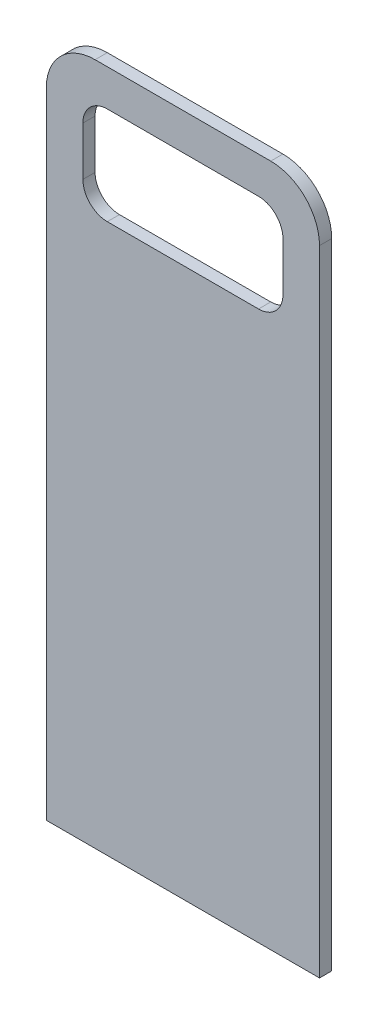
ISO-10303-21;
HEADER;
FILE_DESCRIPTION(('STEP AP214'),'2;1');
FILE_NAME('part.step','',(''),(''),'','','');
FILE_SCHEMA(('AUTOMOTIVE_DESIGN { 1 0 10303 214 1 1 1 1 }'));
ENDSEC;
DATA;
#1=APPLICATION_CONTEXT('core data for automotive mechanical design processes');
#2=APPLICATION_PROTOCOL_DEFINITION('international standard','automotive_design',2000,#1);
#3=PRODUCT_CONTEXT('',#1,'mechanical');
#4=PRODUCT('Part','Part','',(#3));
#5=PRODUCT_RELATED_PRODUCT_CATEGORY('part','',(#4));
#6=PRODUCT_DEFINITION_FORMATION('','',#4);
#7=PRODUCT_DEFINITION_CONTEXT('part definition',#1,'design');
#8=PRODUCT_DEFINITION('design','',#6,#7);
#9=PRODUCT_DEFINITION_SHAPE('','',#8);
#10=(LENGTH_UNIT() NAMED_UNIT(*) SI_UNIT(.MILLI.,.METRE.));
#11=(NAMED_UNIT(*) PLANE_ANGLE_UNIT() SI_UNIT($,.RADIAN.));
#12=(NAMED_UNIT(*) SI_UNIT($,.STERADIAN.) SOLID_ANGLE_UNIT());
#13=UNCERTAINTY_MEASURE_WITH_UNIT(LENGTH_MEASURE(1.E-05),#10,'distance_accuracy_value','');
#14=(GEOMETRIC_REPRESENTATION_CONTEXT(3) GLOBAL_UNCERTAINTY_ASSIGNED_CONTEXT((#13)) GLOBAL_UNIT_ASSIGNED_CONTEXT((#10,
#11,#12)) REPRESENTATION_CONTEXT('',''));
#15=CARTESIAN_POINT('',(0.,0.,0.));
#16=DIRECTION('',(0.,0.,1.));
#17=DIRECTION('',(1.,0.,0.));
#18=AXIS2_PLACEMENT_3D('',#15,#16,#17);
#19=CARTESIAN_POINT('',(0.,0.,5.));
#20=DIRECTION('',(0.,0.,1.));
#21=DIRECTION('',(1.,0.,0.));
#22=AXIS2_PLACEMENT_3D('',#19,#20,#21);
#23=PLANE('',#22);
#24=DIRECTION('',(-1.,0.,0.));
#25=VECTOR('',#24,1.);
#26=CARTESIAN_POINT('',(0.,280.,5.));
#27=LINE('',#26,#25);
#28=CARTESIAN_POINT('',(-20.,280.,5.));
#29=VERTEX_POINT('',#28);
#30=CARTESIAN_POINT('',(-92.,280.,5.));
#31=VERTEX_POINT('',#30);
#32=EDGE_CURVE('E147',#29,#31,#27,.T.);
#33=ORIENTED_EDGE('',*,*,#32,.T.);
#34=CARTESIAN_POINT('',(-92.,260.,5.));
#35=DIRECTION('',(0.,0.,1.));
#36=DIRECTION('',(1.,0.,0.));
#37=AXIS2_PLACEMENT_3D('',#34,#35,#36);
#38=CIRCLE('',#37,20.);
#39=CARTESIAN_POINT('',(-112.,260.,5.));
#40=VERTEX_POINT('',#39);
#41=EDGE_CURVE('E143',#31,#40,#38,.T.);
#42=ORIENTED_EDGE('',*,*,#41,.T.);
#43=DIRECTION('',(0.,-1.,0.));
#44=VECTOR('',#43,1.);
#45=CARTESIAN_POINT('',(-112.,0.,5.));
#46=LINE('',#45,#44);
#47=CARTESIAN_POINT('',(-112.,0.,5.));
#48=VERTEX_POINT('',#47);
#49=EDGE_CURVE('E135',#40,#48,#46,.T.);
#50=ORIENTED_EDGE('',*,*,#49,.T.);
#51=DIRECTION('',(1.,0.,0.));
#52=VECTOR('',#51,1.);
#53=CARTESIAN_POINT('',(0.,0.,5.));
#54=LINE('',#53,#52);
#55=CARTESIAN_POINT('',(0.,0.,5.));
#56=VERTEX_POINT('',#55);
#57=EDGE_CURVE('E140',#48,#56,#54,.T.);
#58=ORIENTED_EDGE('',*,*,#57,.T.);
#59=DIRECTION('',(0.,1.,0.));
#60=VECTOR('',#59,1.);
#61=CARTESIAN_POINT('',(0.,0.,5.));
#62=LINE('',#61,#60);
#63=CARTESIAN_POINT('',(0.,260.,5.));
#64=VERTEX_POINT('',#63);
#65=EDGE_CURVE('E175',#56,#64,#62,.T.);
#66=ORIENTED_EDGE('',*,*,#65,.T.);
#67=CARTESIAN_POINT('',(-20.,260.,5.));
#68=DIRECTION('',(0.,0.,1.));
#69=DIRECTION('',(1.,0.,0.));
#70=AXIS2_PLACEMENT_3D('',#67,#68,#69);
#71=CIRCLE('',#70,20.);
#72=EDGE_CURVE('E187',#64,#29,#71,.T.);
#73=ORIENTED_EDGE('',*,*,#72,.T.);
#74=EDGE_LOOP('',(#33,#42,#50,#58,#66,#73));
#75=FACE_BOUND('',#74,.T.);
#76=DIRECTION('',(-1.,0.,0.));
#77=VECTOR('',#76,1.);
#78=CARTESIAN_POINT('',(-15.,265.,5.));
#79=LINE('',#78,#77);
#80=CARTESIAN_POINT('',(-25.,265.,5.));
#81=VERTEX_POINT('',#80);
#82=CARTESIAN_POINT('',(-87.,265.,5.));
#83=VERTEX_POINT('',#82);
#84=EDGE_CURVE('E242',#81,#83,#79,.T.);
#85=ORIENTED_EDGE('',*,*,#84,.F.);
#86=CARTESIAN_POINT('',(-25.,255.,5.));
#87=DIRECTION('',(0.,0.,1.));
#88=DIRECTION('',(1.,0.,0.));
#89=AXIS2_PLACEMENT_3D('',#86,#87,#88);
#90=CIRCLE('',#89,10.);
#91=CARTESIAN_POINT('',(-15.,255.,5.));
#92=VERTEX_POINT('',#91);
#93=EDGE_CURVE('E11',#81,#92,#90,.F.);
#94=ORIENTED_EDGE('',*,*,#93,.T.);
#95=DIRECTION('',(0.,1.,0.));
#96=VECTOR('',#95,1.);
#97=CARTESIAN_POINT('',(-15.,265.,5.));
#98=LINE('',#97,#96);
#99=CARTESIAN_POINT('',(-15.,235.,5.));
#100=VERTEX_POINT('',#99);
#101=EDGE_CURVE('E240',#100,#92,#98,.T.);
#102=ORIENTED_EDGE('',*,*,#101,.F.);
#103=CARTESIAN_POINT('',(-25.,235.,5.));
#104=DIRECTION('',(0.,0.,1.));
#105=DIRECTION('',(1.,0.,0.));
#106=AXIS2_PLACEMENT_3D('',#103,#104,#105);
#107=CIRCLE('',#106,10.);
#108=CARTESIAN_POINT('',(-25.,225.,5.));
#109=VERTEX_POINT('',#108);
#110=EDGE_CURVE('E221',#100,#109,#107,.F.);
#111=ORIENTED_EDGE('',*,*,#110,.T.);
#112=DIRECTION('',(1.,0.,0.));
#113=VECTOR('',#112,1.);
#114=CARTESIAN_POINT('',(-15.,225.,5.));
#115=LINE('',#114,#113);
#116=CARTESIAN_POINT('',(-87.,225.,5.));
#117=VERTEX_POINT('',#116);
#118=EDGE_CURVE('E170',#117,#109,#115,.T.);
#119=ORIENTED_EDGE('',*,*,#118,.F.);
#120=CARTESIAN_POINT('',(-87.,235.,5.));
#121=DIRECTION('',(0.,0.,1.));
#122=DIRECTION('',(1.,0.,0.));
#123=AXIS2_PLACEMENT_3D('',#120,#121,#122);
#124=CIRCLE('',#123,10.);
#125=CARTESIAN_POINT('',(-97.,235.,5.));
#126=VERTEX_POINT('',#125);
#127=EDGE_CURVE('E213',#117,#126,#124,.F.);
#128=ORIENTED_EDGE('',*,*,#127,.T.);
#129=DIRECTION('',(0.,-1.,0.));
#130=VECTOR('',#129,1.);
#131=CARTESIAN_POINT('',(-97.,265.,5.));
#132=LINE('',#131,#130);
#133=CARTESIAN_POINT('',(-97.,255.,5.));
#134=VERTEX_POINT('',#133);
#135=EDGE_CURVE('E245',#134,#126,#132,.T.);
#136=ORIENTED_EDGE('',*,*,#135,.F.);
#137=CARTESIAN_POINT('',(-87.,255.,5.));
#138=DIRECTION('',(0.,0.,1.));
#139=DIRECTION('',(1.,0.,0.));
#140=AXIS2_PLACEMENT_3D('',#137,#138,#139);
#141=CIRCLE('',#140,10.);
#142=EDGE_CURVE('E217',#134,#83,#141,.F.);
#143=ORIENTED_EDGE('',*,*,#142,.T.);
#144=EDGE_LOOP('',(#85,#94,#102,#111,#119,#128,#136,#143));
#145=FACE_BOUND('',#144,.T.);
#146=ADVANCED_FACE('F35',(#75,#145),#23,.T.);
#147=CARTESIAN_POINT('',(0.,0.,0.));
#148=DIRECTION('',(0.,0.,1.));
#149=DIRECTION('',(1.,0.,0.));
#150=AXIS2_PLACEMENT_3D('',#147,#148,#149);
#151=PLANE('',#150);
#152=DIRECTION('',(0.,-1.,0.));
#153=VECTOR('',#152,1.);
#154=CARTESIAN_POINT('',(-112.,0.,0.));
#155=LINE('',#154,#153);
#156=CARTESIAN_POINT('',(-112.,260.,0.));
#157=VERTEX_POINT('',#156);
#158=CARTESIAN_POINT('',(-112.,0.,0.));
#159=VERTEX_POINT('',#158);
#160=EDGE_CURVE('E153',#157,#159,#155,.T.);
#161=ORIENTED_EDGE('',*,*,#160,.F.);
#162=CARTESIAN_POINT('',(-92.,260.,0.));
#163=DIRECTION('',(0.,0.,1.));
#164=DIRECTION('',(1.,0.,0.));
#165=AXIS2_PLACEMENT_3D('',#162,#163,#164);
#166=CIRCLE('',#165,20.);
#167=CARTESIAN_POINT('',(-92.,280.,0.));
#168=VERTEX_POINT('',#167);
#169=EDGE_CURVE('E180',#157,#168,#166,.F.);
#170=ORIENTED_EDGE('',*,*,#169,.T.);
#171=DIRECTION('',(-1.,0.,0.));
#172=VECTOR('',#171,1.);
#173=CARTESIAN_POINT('',(0.,280.,0.));
#174=LINE('',#173,#172);
#175=CARTESIAN_POINT('',(-20.,280.,0.));
#176=VERTEX_POINT('',#175);
#177=EDGE_CURVE('E169',#176,#168,#174,.T.);
#178=ORIENTED_EDGE('',*,*,#177,.F.);
#179=CARTESIAN_POINT('',(-20.,260.,0.));
#180=DIRECTION('',(0.,0.,1.));
#181=DIRECTION('',(1.,0.,0.));
#182=AXIS2_PLACEMENT_3D('',#179,#180,#181);
#183=CIRCLE('',#182,20.);
#184=CARTESIAN_POINT('',(0.,260.,0.));
#185=VERTEX_POINT('',#184);
#186=EDGE_CURVE('E178',#176,#185,#183,.F.);
#187=ORIENTED_EDGE('',*,*,#186,.T.);
#188=DIRECTION('',(0.,1.,0.));
#189=VECTOR('',#188,1.);
#190=CARTESIAN_POINT('',(0.,0.,0.));
#191=LINE('',#190,#189);
#192=CARTESIAN_POINT('',(0.,0.,0.));
#193=VERTEX_POINT('',#192);
#194=EDGE_CURVE('E166',#193,#185,#191,.T.);
#195=ORIENTED_EDGE('',*,*,#194,.F.);
#196=DIRECTION('',(1.,0.,0.));
#197=VECTOR('',#196,1.);
#198=CARTESIAN_POINT('',(0.,0.,0.));
#199=LINE('',#198,#197);
#200=EDGE_CURVE('E174',#159,#193,#199,.T.);
#201=ORIENTED_EDGE('',*,*,#200,.F.);
#202=EDGE_LOOP('',(#161,#170,#178,#187,#195,#201));
#203=FACE_BOUND('',#202,.T.);
#204=DIRECTION('',(1.,0.,0.));
#205=VECTOR('',#204,1.);
#206=CARTESIAN_POINT('',(-15.,225.,0.));
#207=LINE('',#206,#205);
#208=CARTESIAN_POINT('',(-87.,225.,0.));
#209=VERTEX_POINT('',#208);
#210=CARTESIAN_POINT('',(-25.,225.,0.));
#211=VERTEX_POINT('',#210);
#212=EDGE_CURVE('E243',#209,#211,#207,.T.);
#213=ORIENTED_EDGE('',*,*,#212,.T.);
#214=CARTESIAN_POINT('',(-25.,235.,0.));
#215=DIRECTION('',(0.,0.,1.));
#216=DIRECTION('',(1.,0.,0.));
#217=AXIS2_PLACEMENT_3D('',#214,#215,#216);
#218=CIRCLE('',#217,10.);
#219=CARTESIAN_POINT('',(-15.,235.,0.));
#220=VERTEX_POINT('',#219);
#221=EDGE_CURVE('E219',#211,#220,#218,.T.);
#222=ORIENTED_EDGE('',*,*,#221,.T.);
#223=DIRECTION('',(0.,1.,0.));
#224=VECTOR('',#223,1.);
#225=CARTESIAN_POINT('',(-15.,265.,0.));
#226=LINE('',#225,#224);
#227=CARTESIAN_POINT('',(-15.,255.,0.));
#228=VERTEX_POINT('',#227);
#229=EDGE_CURVE('E229',#220,#228,#226,.T.);
#230=ORIENTED_EDGE('',*,*,#229,.T.);
#231=CARTESIAN_POINT('',(-25.,255.,0.));
#232=DIRECTION('',(0.,0.,1.));
#233=DIRECTION('',(1.,0.,0.));
#234=AXIS2_PLACEMENT_3D('',#231,#232,#233);
#235=CIRCLE('',#234,10.);
#236=CARTESIAN_POINT('',(-25.,265.,0.));
#237=VERTEX_POINT('',#236);
#238=EDGE_CURVE('E43',#228,#237,#235,.T.);
#239=ORIENTED_EDGE('',*,*,#238,.T.);
#240=DIRECTION('',(-1.,0.,0.));
#241=VECTOR('',#240,1.);
#242=CARTESIAN_POINT('',(-15.,265.,0.));
#243=LINE('',#242,#241);
#244=CARTESIAN_POINT('',(-87.,265.,0.));
#245=VERTEX_POINT('',#244);
#246=EDGE_CURVE('E228',#237,#245,#243,.T.);
#247=ORIENTED_EDGE('',*,*,#246,.T.);
#248=CARTESIAN_POINT('',(-87.,255.,0.));
#249=DIRECTION('',(0.,0.,1.));
#250=DIRECTION('',(1.,0.,0.));
#251=AXIS2_PLACEMENT_3D('',#248,#249,#250);
#252=CIRCLE('',#251,10.);
#253=CARTESIAN_POINT('',(-97.,255.,0.));
#254=VERTEX_POINT('',#253);
#255=EDGE_CURVE('E215',#245,#254,#252,.T.);
#256=ORIENTED_EDGE('',*,*,#255,.T.);
#257=DIRECTION('',(0.,-1.,0.));
#258=VECTOR('',#257,1.);
#259=CARTESIAN_POINT('',(-97.,265.,0.));
#260=LINE('',#259,#258);
#261=CARTESIAN_POINT('',(-97.,235.,0.));
#262=VERTEX_POINT('',#261);
#263=EDGE_CURVE('E237',#254,#262,#260,.T.);
#264=ORIENTED_EDGE('',*,*,#263,.T.);
#265=CARTESIAN_POINT('',(-87.,235.,0.));
#266=DIRECTION('',(0.,0.,1.));
#267=DIRECTION('',(1.,0.,0.));
#268=AXIS2_PLACEMENT_3D('',#265,#266,#267);
#269=CIRCLE('',#268,10.);
#270=EDGE_CURVE('E211',#262,#209,#269,.T.);
#271=ORIENTED_EDGE('',*,*,#270,.T.);
#272=EDGE_LOOP('',(#213,#222,#230,#239,#247,#256,#264,#271));
#273=FACE_BOUND('',#272,.T.);
#274=ADVANCED_FACE('F227',(#203,#273),#151,.F.);
#275=CARTESIAN_POINT('',(0.,0.,5.));
#276=DIRECTION('',(-1.,0.,0.));
#277=DIRECTION('',(0.,0.,1.));
#278=AXIS2_PLACEMENT_3D('',#275,#276,#277);
#279=PLANE('',#278);
#280=ORIENTED_EDGE('',*,*,#194,.T.);
#281=DIRECTION('',(0.,0.,-1.));
#282=VECTOR('',#281,1.);
#283=CARTESIAN_POINT('',(0.,260.,5.));
#284=LINE('',#283,#282);
#285=EDGE_CURVE('E190',#185,#64,#284,.F.);
#286=ORIENTED_EDGE('',*,*,#285,.T.);
#287=ORIENTED_EDGE('',*,*,#65,.F.);
#288=DIRECTION('',(0.,0.,-1.));
#289=VECTOR('',#288,1.);
#290=CARTESIAN_POINT('',(0.,0.,5.));
#291=LINE('',#290,#289);
#292=EDGE_CURVE('E157',#56,#193,#291,.T.);
#293=ORIENTED_EDGE('',*,*,#292,.T.);
#294=EDGE_LOOP('',(#280,#286,#287,#293));
#295=FACE_BOUND('',#294,.T.);
#296=ADVANCED_FACE('F267',(#295),#279,.F.);
#297=CARTESIAN_POINT('',(0.,280.,5.));
#298=DIRECTION('',(0.,-1.,0.));
#299=DIRECTION('',(0.,0.,-1.));
#300=AXIS2_PLACEMENT_3D('',#297,#298,#299);
#301=PLANE('',#300);
#302=ORIENTED_EDGE('',*,*,#177,.T.);
#303=DIRECTION('',(0.,0.,-1.));
#304=VECTOR('',#303,1.);
#305=CARTESIAN_POINT('',(-92.,280.,5.));
#306=LINE('',#305,#304);
#307=EDGE_CURVE('E185',#168,#31,#306,.F.);
#308=ORIENTED_EDGE('',*,*,#307,.T.);
#309=ORIENTED_EDGE('',*,*,#32,.F.);
#310=DIRECTION('',(0.,0.,-1.));
#311=VECTOR('',#310,1.);
#312=CARTESIAN_POINT('',(-20.,280.,5.));
#313=LINE('',#312,#311);
#314=EDGE_CURVE('E182',#29,#176,#313,.T.);
#315=ORIENTED_EDGE('',*,*,#314,.T.);
#316=EDGE_LOOP('',(#302,#308,#309,#315));
#317=FACE_BOUND('',#316,.T.);
#318=ADVANCED_FACE('F271',(#317),#301,.F.);
#319=CARTESIAN_POINT('',(-112.,0.,5.));
#320=DIRECTION('',(1.,0.,0.));
#321=DIRECTION('',(0.,0.,-1.));
#322=AXIS2_PLACEMENT_3D('',#319,#320,#321);
#323=PLANE('',#322);
#324=ORIENTED_EDGE('',*,*,#49,.F.);
#325=DIRECTION('',(0.,0.,-1.));
#326=VECTOR('',#325,1.);
#327=CARTESIAN_POINT('',(-112.,260.,5.));
#328=LINE('',#327,#326);
#329=EDGE_CURVE('E156',#40,#157,#328,.T.);
#330=ORIENTED_EDGE('',*,*,#329,.T.);
#331=ORIENTED_EDGE('',*,*,#160,.T.);
#332=DIRECTION('',(0.,0.,-1.));
#333=VECTOR('',#332,1.);
#334=CARTESIAN_POINT('',(-112.,0.,5.));
#335=LINE('',#334,#333);
#336=EDGE_CURVE('E150',#48,#159,#335,.T.);
#337=ORIENTED_EDGE('',*,*,#336,.F.);
#338=EDGE_LOOP('',(#324,#330,#331,#337));
#339=FACE_BOUND('',#338,.T.);
#340=ADVANCED_FACE('F151',(#339),#323,.F.);
#341=CARTESIAN_POINT('',(0.,0.,5.));
#342=DIRECTION('',(0.,1.,0.));
#343=DIRECTION('',(-1.,0.,0.));
#344=AXIS2_PLACEMENT_3D('',#341,#342,#343);
#345=PLANE('',#344);
#346=ORIENTED_EDGE('',*,*,#200,.T.);
#347=ORIENTED_EDGE('',*,*,#292,.F.);
#348=ORIENTED_EDGE('',*,*,#57,.F.);
#349=ORIENTED_EDGE('',*,*,#336,.T.);
#350=EDGE_LOOP('',(#346,#347,#348,#349));
#351=FACE_BOUND('',#350,.T.);
#352=ADVANCED_FACE('F159',(#351),#345,.F.);
#353=CARTESIAN_POINT('',(-15.,265.,5.));
#354=DIRECTION('',(-1.,0.,0.));
#355=DIRECTION('',(0.,-1.,0.));
#356=AXIS2_PLACEMENT_3D('',#353,#354,#355);
#357=PLANE('',#356);
#358=ORIENTED_EDGE('',*,*,#229,.F.);
#359=DIRECTION('',(0.,0.,-1.));
#360=VECTOR('',#359,1.);
#361=CARTESIAN_POINT('',(-15.,235.,5.));
#362=LINE('',#361,#360);
#363=EDGE_CURVE('E55',#220,#100,#362,.F.);
#364=ORIENTED_EDGE('',*,*,#363,.T.);
#365=ORIENTED_EDGE('',*,*,#101,.T.);
#366=DIRECTION('',(0.,0.,-1.));
#367=VECTOR('',#366,1.);
#368=CARTESIAN_POINT('',(-15.,255.,0.));
#369=LINE('',#368,#367);
#370=EDGE_CURVE('E207',#92,#228,#369,.T.);
#371=ORIENTED_EDGE('',*,*,#370,.T.);
#372=EDGE_LOOP('',(#358,#364,#365,#371));
#373=FACE_BOUND('',#372,.T.);
#374=ADVANCED_FACE('F239',(#373),#357,.T.);
#375=CARTESIAN_POINT('',(-15.,265.,5.));
#376=DIRECTION('',(0.,-1.,0.));
#377=DIRECTION('',(0.,0.,-1.));
#378=AXIS2_PLACEMENT_3D('',#375,#376,#377);
#379=PLANE('',#378);
#380=ORIENTED_EDGE('',*,*,#84,.T.);
#381=DIRECTION('',(0.,0.,-1.));
#382=VECTOR('',#381,1.);
#383=CARTESIAN_POINT('',(-87.,265.,0.));
#384=LINE('',#383,#382);
#385=EDGE_CURVE('E204',#83,#245,#384,.T.);
#386=ORIENTED_EDGE('',*,*,#385,.T.);
#387=ORIENTED_EDGE('',*,*,#246,.F.);
#388=DIRECTION('',(0.,0.,-1.));
#389=VECTOR('',#388,1.);
#390=CARTESIAN_POINT('',(-25.,265.,5.));
#391=LINE('',#390,#389);
#392=EDGE_CURVE('E202',#237,#81,#391,.F.);
#393=ORIENTED_EDGE('',*,*,#392,.T.);
#394=EDGE_LOOP('',(#380,#386,#387,#393));
#395=FACE_BOUND('',#394,.T.);
#396=ADVANCED_FACE('F235',(#395),#379,.T.);
#397=CARTESIAN_POINT('',(-97.,265.,5.));
#398=DIRECTION('',(1.,0.,0.));
#399=DIRECTION('',(0.,0.,-1.));
#400=AXIS2_PLACEMENT_3D('',#397,#398,#399);
#401=PLANE('',#400);
#402=ORIENTED_EDGE('',*,*,#135,.T.);
#403=DIRECTION('',(0.,0.,-1.));
#404=VECTOR('',#403,1.);
#405=CARTESIAN_POINT('',(-97.,235.,0.));
#406=LINE('',#405,#404);
#407=EDGE_CURVE('E194',#126,#262,#406,.T.);
#408=ORIENTED_EDGE('',*,*,#407,.T.);
#409=ORIENTED_EDGE('',*,*,#263,.F.);
#410=DIRECTION('',(0.,0.,-1.));
#411=VECTOR('',#410,1.);
#412=CARTESIAN_POINT('',(-97.,255.,5.));
#413=LINE('',#412,#411);
#414=EDGE_CURVE('E192',#254,#134,#413,.F.);
#415=ORIENTED_EDGE('',*,*,#414,.T.);
#416=EDGE_LOOP('',(#402,#408,#409,#415));
#417=FACE_BOUND('',#416,.T.);
#418=ADVANCED_FACE('F296',(#417),#401,.T.);
#419=CARTESIAN_POINT('',(-15.,225.,5.));
#420=DIRECTION('',(0.,1.,0.));
#421=DIRECTION('',(0.,0.,1.));
#422=AXIS2_PLACEMENT_3D('',#419,#420,#421);
#423=PLANE('',#422);
#424=ORIENTED_EDGE('',*,*,#212,.F.);
#425=DIRECTION('',(0.,0.,-1.));
#426=VECTOR('',#425,1.);
#427=CARTESIAN_POINT('',(-87.,225.,5.));
#428=LINE('',#427,#426);
#429=EDGE_CURVE('E200',#209,#117,#428,.F.);
#430=ORIENTED_EDGE('',*,*,#429,.T.);
#431=ORIENTED_EDGE('',*,*,#118,.T.);
#432=DIRECTION('',(0.,0.,-1.));
#433=VECTOR('',#432,1.);
#434=CARTESIAN_POINT('',(-25.,225.,0.));
#435=LINE('',#434,#433);
#436=EDGE_CURVE('E197',#109,#211,#435,.T.);
#437=ORIENTED_EDGE('',*,*,#436,.T.);
#438=EDGE_LOOP('',(#424,#430,#431,#437));
#439=FACE_BOUND('',#438,.T.);
#440=ADVANCED_FACE('F300',(#439),#423,.T.);
#441=CARTESIAN_POINT('',(-92.,260.,5.));
#442=DIRECTION('',(0.,0.,-1.));
#443=DIRECTION('',(-1.,0.,0.));
#444=AXIS2_PLACEMENT_3D('',#441,#442,#443);
#445=CYLINDRICAL_SURFACE('',#444,20.);
#446=ORIENTED_EDGE('',*,*,#41,.F.);
#447=ORIENTED_EDGE('',*,*,#307,.F.);
#448=ORIENTED_EDGE('',*,*,#169,.F.);
#449=ORIENTED_EDGE('',*,*,#329,.F.);
#450=EDGE_LOOP('',(#446,#447,#448,#449));
#451=FACE_BOUND('',#450,.T.);
#452=ADVANCED_FACE('F262',(#451),#445,.T.);
#453=CARTESIAN_POINT('',(-20.,260.,5.));
#454=DIRECTION('',(0.,0.,-1.));
#455=DIRECTION('',(-1.,0.,0.));
#456=AXIS2_PLACEMENT_3D('',#453,#454,#455);
#457=CYLINDRICAL_SURFACE('',#456,20.);
#458=ORIENTED_EDGE('',*,*,#72,.F.);
#459=ORIENTED_EDGE('',*,*,#285,.F.);
#460=ORIENTED_EDGE('',*,*,#186,.F.);
#461=ORIENTED_EDGE('',*,*,#314,.F.);
#462=EDGE_LOOP('',(#458,#459,#460,#461));
#463=FACE_BOUND('',#462,.T.);
#464=ADVANCED_FACE('F270',(#463),#457,.T.);
#465=CARTESIAN_POINT('',(-87.,235.,5.));
#466=DIRECTION('',(0.,0.,1.));
#467=DIRECTION('',(1.,0.,0.));
#468=AXIS2_PLACEMENT_3D('',#465,#466,#467);
#469=CYLINDRICAL_SURFACE('',#468,10.);
#470=ORIENTED_EDGE('',*,*,#127,.F.);
#471=ORIENTED_EDGE('',*,*,#429,.F.);
#472=ORIENTED_EDGE('',*,*,#270,.F.);
#473=ORIENTED_EDGE('',*,*,#407,.F.);
#474=EDGE_LOOP('',(#470,#471,#472,#473));
#475=FACE_BOUND('',#474,.T.);
#476=ADVANCED_FACE('F316',(#475),#469,.F.);
#477=CARTESIAN_POINT('',(-87.,255.,5.));
#478=DIRECTION('',(0.,0.,1.));
#479=DIRECTION('',(1.,0.,0.));
#480=AXIS2_PLACEMENT_3D('',#477,#478,#479);
#481=CYLINDRICAL_SURFACE('',#480,10.);
#482=ORIENTED_EDGE('',*,*,#142,.F.);
#483=ORIENTED_EDGE('',*,*,#414,.F.);
#484=ORIENTED_EDGE('',*,*,#255,.F.);
#485=ORIENTED_EDGE('',*,*,#385,.F.);
#486=EDGE_LOOP('',(#482,#483,#484,#485));
#487=FACE_BOUND('',#486,.T.);
#488=ADVANCED_FACE('F323',(#487),#481,.F.);
#489=CARTESIAN_POINT('',(-25.,235.,5.));
#490=DIRECTION('',(0.,0.,1.));
#491=DIRECTION('',(1.,0.,0.));
#492=AXIS2_PLACEMENT_3D('',#489,#490,#491);
#493=CYLINDRICAL_SURFACE('',#492,10.);
#494=ORIENTED_EDGE('',*,*,#110,.F.);
#495=ORIENTED_EDGE('',*,*,#363,.F.);
#496=ORIENTED_EDGE('',*,*,#221,.F.);
#497=ORIENTED_EDGE('',*,*,#436,.F.);
#498=EDGE_LOOP('',(#494,#495,#496,#497));
#499=FACE_BOUND('',#498,.T.);
#500=ADVANCED_FACE('F325',(#499),#493,.F.);
#501=CARTESIAN_POINT('',(-25.,255.,5.));
#502=DIRECTION('',(0.,0.,1.));
#503=DIRECTION('',(1.,0.,0.));
#504=AXIS2_PLACEMENT_3D('',#501,#502,#503);
#505=CYLINDRICAL_SURFACE('',#504,10.);
#506=ORIENTED_EDGE('',*,*,#93,.F.);
#507=ORIENTED_EDGE('',*,*,#392,.F.);
#508=ORIENTED_EDGE('',*,*,#238,.F.);
#509=ORIENTED_EDGE('',*,*,#370,.F.);
#510=EDGE_LOOP('',(#506,#507,#508,#509));
#511=FACE_BOUND('',#510,.T.);
#512=ADVANCED_FACE('F37',(#511),#505,.F.);
#513=CLOSED_SHELL('',(#146,#274,#296,#318,#340,#352,#374,#396,#418,#440,#452,#464,#476,#488,
#500,#512));
#514=MANIFOLD_SOLID_BREP('B2',#513);
#515=ADVANCED_BREP_SHAPE_REPRESENTATION('',(#18,#514),#14);
#516=SHAPE_DEFINITION_REPRESENTATION(#9,#515);
ENDSEC;
END-ISO-10303-21;
